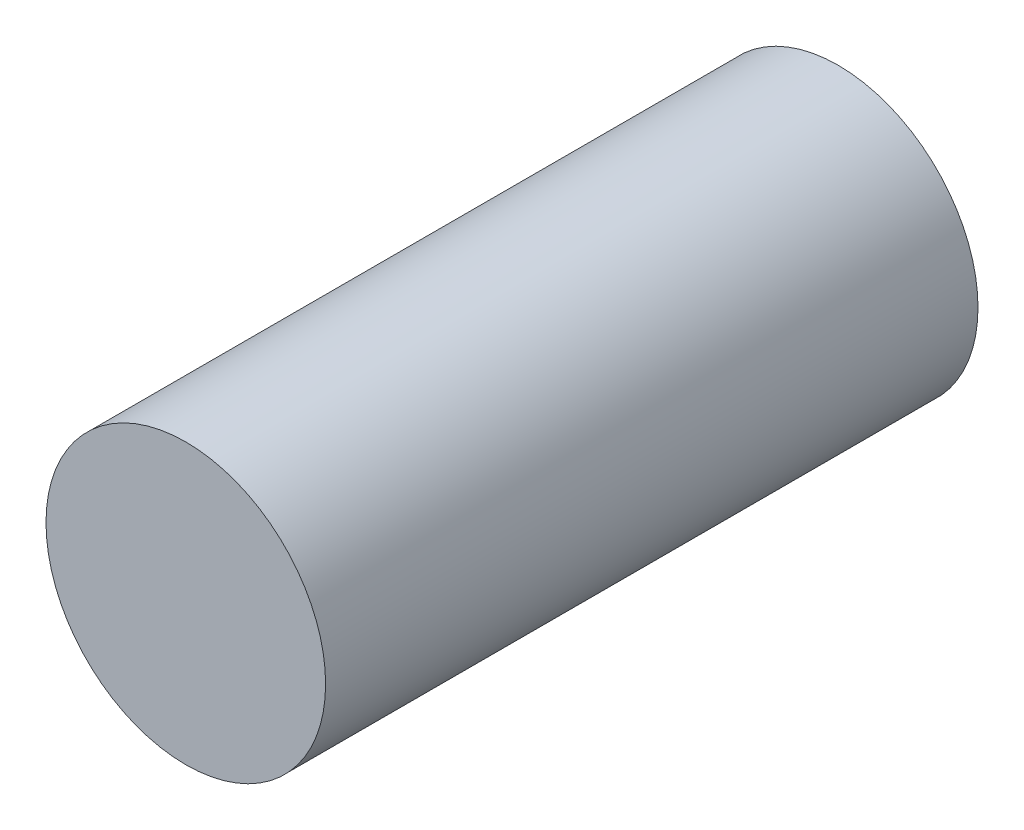
ISO-10303-21;
HEADER;
FILE_DESCRIPTION(('STEP AP214'),'2;1');
FILE_NAME('part.step','',(''),(''),'','','');
FILE_SCHEMA(('AUTOMOTIVE_DESIGN { 1 0 10303 214 1 1 1 1 }'));
ENDSEC;
DATA;
#1=APPLICATION_CONTEXT('core data for automotive mechanical design processes');
#2=APPLICATION_PROTOCOL_DEFINITION('international standard','automotive_design',2000,#1);
#3=PRODUCT_CONTEXT('',#1,'mechanical');
#4=PRODUCT('Part','Part','',(#3));
#5=PRODUCT_RELATED_PRODUCT_CATEGORY('part','',(#4));
#6=PRODUCT_DEFINITION_FORMATION('','',#4);
#7=PRODUCT_DEFINITION_CONTEXT('part definition',#1,'design');
#8=PRODUCT_DEFINITION('design','',#6,#7);
#9=PRODUCT_DEFINITION_SHAPE('','',#8);
#10=(LENGTH_UNIT() NAMED_UNIT(*) SI_UNIT(.MILLI.,.METRE.));
#11=(NAMED_UNIT(*) PLANE_ANGLE_UNIT() SI_UNIT($,.RADIAN.));
#12=(NAMED_UNIT(*) SI_UNIT($,.STERADIAN.) SOLID_ANGLE_UNIT());
#13=UNCERTAINTY_MEASURE_WITH_UNIT(LENGTH_MEASURE(1.E-05),#10,'distance_accuracy_value','');
#14=(GEOMETRIC_REPRESENTATION_CONTEXT(3) GLOBAL_UNCERTAINTY_ASSIGNED_CONTEXT((#13)) GLOBAL_UNIT_ASSIGNED_CONTEXT((#10,
#11,#12)) REPRESENTATION_CONTEXT('',''));
#15=CARTESIAN_POINT('',(0.,0.,0.));
#16=DIRECTION('',(0.,0.,1.));
#17=DIRECTION('',(1.,0.,0.));
#18=AXIS2_PLACEMENT_3D('',#15,#16,#17);
#19=CARTESIAN_POINT('',(0.,0.,7.));
#20=DIRECTION('',(0.,0.,-1.));
#21=DIRECTION('',(-1.,0.,0.));
#22=AXIS2_PLACEMENT_3D('',#19,#20,#21);
#23=CYLINDRICAL_SURFACE('',#22,1.5);
#24=CARTESIAN_POINT('',(0.,0.,7.));
#25=DIRECTION('',(0.,0.,1.));
#26=DIRECTION('',(1.,0.,0.));
#27=AXIS2_PLACEMENT_3D('',#24,#25,#26);
#28=CIRCLE('',#27,1.5);
#29=CARTESIAN_POINT('',(1.5,0.,7.));
#30=VERTEX_POINT('',#29);
#31=EDGE_CURVE('E10',#30,#30,#28,.T.);
#32=ORIENTED_EDGE('',*,*,#31,.F.);
#33=EDGE_LOOP('',(#32));
#34=FACE_BOUND('',#33,.T.);
#35=CARTESIAN_POINT('',(0.,0.,0.));
#36=DIRECTION('',(0.,0.,1.));
#37=DIRECTION('',(1.,0.,0.));
#38=AXIS2_PLACEMENT_3D('',#35,#36,#37);
#39=CIRCLE('',#38,1.5);
#40=CARTESIAN_POINT('',(1.5,0.,0.));
#41=VERTEX_POINT('',#40);
#42=EDGE_CURVE('E35',#41,#41,#39,.T.);
#43=ORIENTED_EDGE('',*,*,#42,.T.);
#44=EDGE_LOOP('',(#43));
#45=FACE_BOUND('',#44,.T.);
#46=ADVANCED_FACE('F32',(#34,#45),#23,.T.);
#47=CARTESIAN_POINT('',(0.,0.,7.));
#48=DIRECTION('',(0.,0.,1.));
#49=DIRECTION('',(1.,0.,0.));
#50=AXIS2_PLACEMENT_3D('',#47,#48,#49);
#51=PLANE('',#50);
#52=ORIENTED_EDGE('',*,*,#31,.T.);
#53=EDGE_LOOP('',(#52));
#54=FACE_BOUND('',#53,.T.);
#55=ADVANCED_FACE('F47',(#54),#51,.T.);
#56=CARTESIAN_POINT('',(0.,0.,0.));
#57=DIRECTION('',(0.,0.,1.));
#58=DIRECTION('',(1.,0.,0.));
#59=AXIS2_PLACEMENT_3D('',#56,#57,#58);
#60=PLANE('',#59);
#61=ORIENTED_EDGE('',*,*,#42,.F.);
#62=EDGE_LOOP('',(#61));
#63=FACE_BOUND('',#62,.T.);
#64=ADVANCED_FACE('F45',(#63),#60,.F.);
#65=CLOSED_SHELL('',(#46,#55,#64));
#66=MANIFOLD_SOLID_BREP('B2',#65);
#67=ADVANCED_BREP_SHAPE_REPRESENTATION('',(#18,#66),#14);
#68=SHAPE_DEFINITION_REPRESENTATION(#9,#67);
ENDSEC;
END-ISO-10303-21;
